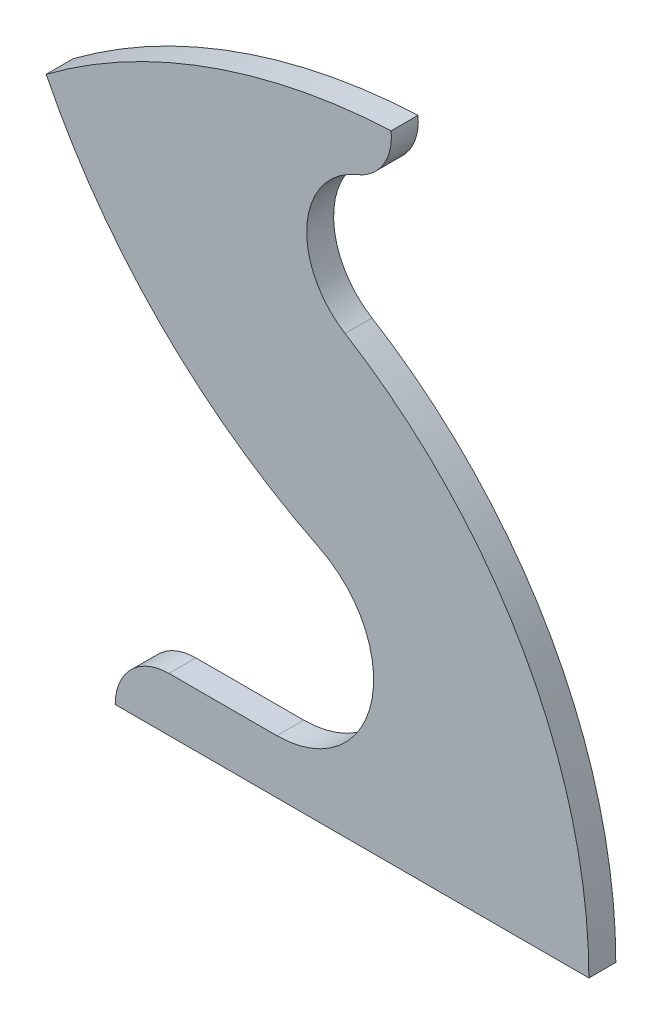
ISO-10303-21;
HEADER;
FILE_DESCRIPTION(('STEP AP214'),'2;1');
FILE_NAME('part.step','',(''),(''),'','','');
FILE_SCHEMA(('AUTOMOTIVE_DESIGN { 1 0 10303 214 1 1 1 1 }'));
ENDSEC;
DATA;
#1=APPLICATION_CONTEXT('core data for automotive mechanical design processes');
#2=APPLICATION_PROTOCOL_DEFINITION('international standard','automotive_design',2000,#1);
#3=PRODUCT_CONTEXT('',#1,'mechanical');
#4=PRODUCT('Part','Part','',(#3));
#5=PRODUCT_RELATED_PRODUCT_CATEGORY('part','',(#4));
#6=PRODUCT_DEFINITION_FORMATION('','',#4);
#7=PRODUCT_DEFINITION_CONTEXT('part definition',#1,'design');
#8=PRODUCT_DEFINITION('design','',#6,#7);
#9=PRODUCT_DEFINITION_SHAPE('','',#8);
#10=(LENGTH_UNIT() NAMED_UNIT(*) SI_UNIT(.MILLI.,.METRE.));
#11=(NAMED_UNIT(*) PLANE_ANGLE_UNIT() SI_UNIT($,.RADIAN.));
#12=(NAMED_UNIT(*) SI_UNIT($,.STERADIAN.) SOLID_ANGLE_UNIT());
#13=UNCERTAINTY_MEASURE_WITH_UNIT(LENGTH_MEASURE(1.E-05),#10,'distance_accuracy_value','');
#14=(GEOMETRIC_REPRESENTATION_CONTEXT(3) GLOBAL_UNCERTAINTY_ASSIGNED_CONTEXT((#13)) GLOBAL_UNIT_ASSIGNED_CONTEXT((#10,
#11,#12)) REPRESENTATION_CONTEXT('',''));
#15=CARTESIAN_POINT('',(0.,0.,0.));
#16=DIRECTION('',(0.,0.,1.));
#17=DIRECTION('',(1.,0.,0.));
#18=AXIS2_PLACEMENT_3D('',#15,#16,#17);
#19=CARTESIAN_POINT('',(11.2916982495796,89.0411675595262,5.));
#20=DIRECTION('',(0.,0.,-1.));
#21=DIRECTION('',(-1.,0.,0.));
#22=AXIS2_PLACEMENT_3D('',#19,#20,#21);
#23=CYLINDRICAL_SURFACE('',#22,9.999999999998);
#24=CARTESIAN_POINT('',(11.2916982495796,89.0411675595262,0.));
#25=DIRECTION('',(0.,0.,1.));
#26=DIRECTION('',(1.,0.,0.));
#27=AXIS2_PLACEMENT_3D('',#24,#25,#26);
#28=CIRCLE('',#27,9.999999999998);
#29=CARTESIAN_POINT('',(14.9970954723536,79.7530013561572,0.));
#30=VERTEX_POINT('',#29);
#31=CARTESIAN_POINT('',(21.2520717383504,89.930526859332,0.));
#32=VERTEX_POINT('',#31);
#33=EDGE_CURVE('E137',#30,#32,#28,.T.);
#34=ORIENTED_EDGE('',*,*,#33,.T.);
#35=DIRECTION('',(0.,0.,-1.));
#36=VECTOR('',#35,1.);
#37=CARTESIAN_POINT('',(21.2520717383504,89.930526859332,5.));
#38=LINE('',#37,#36);
#39=CARTESIAN_POINT('',(21.2520717383504,89.930526859332,5.));
#40=VERTEX_POINT('',#39);
#41=EDGE_CURVE('E11',#40,#32,#38,.T.);
#42=ORIENTED_EDGE('',*,*,#41,.F.);
#43=CARTESIAN_POINT('',(11.2916982495796,89.0411675595262,5.));
#44=DIRECTION('',(0.,0.,1.));
#45=DIRECTION('',(1.,0.,0.));
#46=AXIS2_PLACEMENT_3D('',#43,#44,#45);
#47=CIRCLE('',#46,9.999999999998);
#48=CARTESIAN_POINT('',(14.9970954723536,79.7530013561572,5.));
#49=VERTEX_POINT('',#48);
#50=EDGE_CURVE('E158',#49,#40,#47,.T.);
#51=ORIENTED_EDGE('',*,*,#50,.F.);
#52=DIRECTION('',(0.,0.,-1.));
#53=VECTOR('',#52,1.);
#54=CARTESIAN_POINT('',(14.9970954723536,79.7530013561572,5.));
#55=LINE('',#54,#53);
#56=EDGE_CURVE('E49',#49,#30,#55,.T.);
#57=ORIENTED_EDGE('',*,*,#56,.T.);
#58=EDGE_LOOP('',(#34,#42,#51,#57));
#59=FACE_BOUND('',#58,.T.);
#60=ADVANCED_FACE('F33',(#59),#23,.T.);
#61=CARTESIAN_POINT('',(26.5788648030549,-25.9471037500549,5.));
#62=DIRECTION('',(0.,0.,-1.));
#63=DIRECTION('',(-1.,0.,0.));
#64=AXIS2_PLACEMENT_3D('',#61,#62,#63);
#65=CYLINDRICAL_SURFACE('',#64,115.999999999999);
#66=CARTESIAN_POINT('',(26.5788648030549,-25.9471037500549,0.));
#67=DIRECTION('',(0.,0.,1.));
#68=DIRECTION('',(1.,0.,0.));
#69=AXIS2_PLACEMENT_3D('',#66,#67,#68);
#70=CIRCLE('',#69,115.999999999999);
#71=CARTESIAN_POINT('',(-42.8351254526563,66.9921127130709,0.));
#72=VERTEX_POINT('',#71);
#73=EDGE_CURVE('E139',#32,#72,#70,.T.);
#74=ORIENTED_EDGE('',*,*,#73,.T.);
#75=DIRECTION('',(0.,0.,-1.));
#76=VECTOR('',#75,1.);
#77=CARTESIAN_POINT('',(-42.8351254526563,66.9921127130709,5.));
#78=LINE('',#77,#76);
#79=CARTESIAN_POINT('',(-42.8351254526563,66.9921127130709,5.));
#80=VERTEX_POINT('',#79);
#81=EDGE_CURVE('E41',#80,#72,#78,.T.);
#82=ORIENTED_EDGE('',*,*,#81,.F.);
#83=CARTESIAN_POINT('',(26.5788648030549,-25.9471037500549,5.));
#84=DIRECTION('',(0.,0.,1.));
#85=DIRECTION('',(1.,0.,0.));
#86=AXIS2_PLACEMENT_3D('',#83,#84,#85);
#87=CIRCLE('',#86,115.999999999999);
#88=EDGE_CURVE('E91',#40,#80,#87,.T.);
#89=ORIENTED_EDGE('',*,*,#88,.F.);
#90=ORIENTED_EDGE('',*,*,#41,.T.);
#91=EDGE_LOOP('',(#74,#82,#89,#90));
#92=FACE_BOUND('',#91,.T.);
#93=ADVANCED_FACE('F192',(#92),#65,.T.);
#94=CARTESIAN_POINT('',(57.9835512224669,116.911295576453,5.));
#95=DIRECTION('',(0.,0.,-1.));
#96=DIRECTION('',(-1.,0.,0.));
#97=AXIS2_PLACEMENT_3D('',#94,#95,#96);
#98=CYLINDRICAL_SURFACE('',#97,112.500357262858);
#99=CARTESIAN_POINT('',(57.9835512224669,116.911295576453,0.));
#100=DIRECTION('',(0.,0.,1.));
#101=DIRECTION('',(1.,0.,0.));
#102=AXIS2_PLACEMENT_3D('',#99,#100,#101);
#103=CIRCLE('',#102,112.500357262858);
#104=CARTESIAN_POINT('',(7.99770930819777,16.1256517952451,0.));
#105=VERTEX_POINT('',#104);
#106=EDGE_CURVE('E141',#72,#105,#103,.T.);
#107=ORIENTED_EDGE('',*,*,#106,.T.);
#108=DIRECTION('',(0.,0.,-1.));
#109=VECTOR('',#108,1.);
#110=CARTESIAN_POINT('',(7.99770930819777,16.1256517952451,5.));
#111=LINE('',#110,#109);
#112=CARTESIAN_POINT('',(7.99770930819777,16.1256517952451,5.));
#113=VERTEX_POINT('',#112);
#114=EDGE_CURVE('E166',#113,#105,#111,.T.);
#115=ORIENTED_EDGE('',*,*,#114,.F.);
#116=CARTESIAN_POINT('',(57.9835512224669,116.911295576453,5.));
#117=DIRECTION('',(0.,0.,1.));
#118=DIRECTION('',(1.,0.,0.));
#119=AXIS2_PLACEMENT_3D('',#116,#117,#118);
#120=CIRCLE('',#119,112.500357262858);
#121=EDGE_CURVE('E173',#80,#113,#120,.T.);
#122=ORIENTED_EDGE('',*,*,#121,.F.);
#123=ORIENTED_EDGE('',*,*,#81,.T.);
#124=EDGE_LOOP('',(#107,#115,#122,#123));
#125=FACE_BOUND('',#124,.T.);
#126=ADVANCED_FACE('F171',(#125),#98,.T.);
#127=CARTESIAN_POINT('',(0.,0.,5.));
#128=DIRECTION('',(0.,0.,-1.));
#129=DIRECTION('',(-1.,0.,0.));
#130=AXIS2_PLACEMENT_3D('',#127,#128,#129);
#131=CYLINDRICAL_SURFACE('',#130,17.9999999999979);
#132=CARTESIAN_POINT('',(0.,0.,0.));
#133=DIRECTION('',(0.,0.,1.));
#134=DIRECTION('',(1.,0.,0.));
#135=AXIS2_PLACEMENT_3D('',#132,#133,#134);
#136=CIRCLE('',#135,17.9999999999979);
#137=CARTESIAN_POINT('',(0.,-17.9999999999979,0.));
#138=VERTEX_POINT('',#137);
#139=EDGE_CURVE('E144',#138,#105,#136,.T.);
#140=ORIENTED_EDGE('',*,*,#139,.F.);
#141=DIRECTION('',(0.,0.,-1.));
#142=VECTOR('',#141,1.);
#143=CARTESIAN_POINT('',(0.,-17.9999999999979,5.));
#144=LINE('',#143,#142);
#145=CARTESIAN_POINT('',(0.,-17.9999999999979,5.));
#146=VERTEX_POINT('',#145);
#147=EDGE_CURVE('E164',#146,#138,#144,.T.);
#148=ORIENTED_EDGE('',*,*,#147,.F.);
#149=CARTESIAN_POINT('',(0.,0.,5.));
#150=DIRECTION('',(0.,0.,1.));
#151=DIRECTION('',(1.,0.,0.));
#152=AXIS2_PLACEMENT_3D('',#149,#150,#151);
#153=CIRCLE('',#152,17.9999999999979);
#154=EDGE_CURVE('E183',#146,#113,#153,.T.);
#155=ORIENTED_EDGE('',*,*,#154,.T.);
#156=ORIENTED_EDGE('',*,*,#114,.T.);
#157=EDGE_LOOP('',(#140,#148,#155,#156));
#158=FACE_BOUND('',#157,.T.);
#159=ADVANCED_FACE('F180',(#158),#131,.F.);
#160=CARTESIAN_POINT('',(1.91564088810925E-12,-17.9999999999979,5.));
#161=DIRECTION('',(-1.0642449378386E-13,1.,0.));
#162=DIRECTION('',(-1.,-1.0642449378386E-13,0.));
#163=AXIS2_PLACEMENT_3D('',#160,#161,#162);
#164=PLANE('',#163);
#165=DIRECTION('',(1.,1.0642449378386E-13,0.));
#166=VECTOR('',#165,1.);
#167=CARTESIAN_POINT('',(1.91564088810925E-12,-17.9999999999979,0.));
#168=LINE('',#167,#166);
#169=CARTESIAN_POINT('',(-20.0164487775331,-18.,0.));
#170=VERTEX_POINT('',#169);
#171=EDGE_CURVE('E147',#170,#138,#168,.T.);
#172=ORIENTED_EDGE('',*,*,#171,.F.);
#173=DIRECTION('',(0.,0.,-1.));
#174=VECTOR('',#173,1.);
#175=CARTESIAN_POINT('',(-20.0164487775331,-18.,5.));
#176=LINE('',#175,#174);
#177=CARTESIAN_POINT('',(-20.0164487775331,-18.,5.));
#178=VERTEX_POINT('',#177);
#179=EDGE_CURVE('E162',#178,#170,#176,.T.);
#180=ORIENTED_EDGE('',*,*,#179,.F.);
#181=DIRECTION('',(1.,1.0642449378386E-13,0.));
#182=VECTOR('',#181,1.);
#183=CARTESIAN_POINT('',(1.91564088810925E-12,-17.9999999999979,5.));
#184=LINE('',#183,#182);
#185=EDGE_CURVE('E185',#178,#146,#184,.T.);
#186=ORIENTED_EDGE('',*,*,#185,.T.);
#187=ORIENTED_EDGE('',*,*,#147,.T.);
#188=EDGE_LOOP('',(#172,#180,#186,#187));
#189=FACE_BOUND('',#188,.T.);
#190=ADVANCED_FACE('F202',(#189),#164,.T.);
#191=CARTESIAN_POINT('',(-20.0164487775331,-28.,5.));
#192=DIRECTION('',(0.,0.,-1.));
#193=DIRECTION('',(-1.,0.,0.));
#194=AXIS2_PLACEMENT_3D('',#191,#192,#193);
#195=CYLINDRICAL_SURFACE('',#194,10.);
#196=CARTESIAN_POINT('',(-20.0164487775331,-28.,0.));
#197=DIRECTION('',(0.,0.,1.));
#198=DIRECTION('',(1.,0.,0.));
#199=AXIS2_PLACEMENT_3D('',#196,#197,#198);
#200=CIRCLE('',#199,10.);
#201=CARTESIAN_POINT('',(-30.0164487775331,-28.,0.));
#202=VERTEX_POINT('',#201);
#203=EDGE_CURVE('E150',#170,#202,#200,.T.);
#204=ORIENTED_EDGE('',*,*,#203,.T.);
#205=DIRECTION('',(0.,0.,-1.));
#206=VECTOR('',#205,1.);
#207=CARTESIAN_POINT('',(-30.0164487775331,-28.,5.));
#208=LINE('',#207,#206);
#209=CARTESIAN_POINT('',(-30.0164487775331,-28.,5.));
#210=VERTEX_POINT('',#209);
#211=EDGE_CURVE('E129',#210,#202,#208,.T.);
#212=ORIENTED_EDGE('',*,*,#211,.F.);
#213=CARTESIAN_POINT('',(-20.0164487775331,-28.,5.));
#214=DIRECTION('',(0.,0.,1.));
#215=DIRECTION('',(1.,0.,0.));
#216=AXIS2_PLACEMENT_3D('',#213,#214,#215);
#217=CIRCLE('',#216,10.);
#218=EDGE_CURVE('E117',#178,#210,#217,.T.);
#219=ORIENTED_EDGE('',*,*,#218,.F.);
#220=ORIENTED_EDGE('',*,*,#179,.T.);
#221=EDGE_LOOP('',(#204,#212,#219,#220));
#222=FACE_BOUND('',#221,.T.);
#223=ADVANCED_FACE('F205',(#222),#195,.T.);
#224=CARTESIAN_POINT('',(0.,-28.,5.));
#225=DIRECTION('',(0.,1.,0.));
#226=DIRECTION('',(-1.,0.,0.));
#227=AXIS2_PLACEMENT_3D('',#224,#225,#226);
#228=PLANE('',#227);
#229=DIRECTION('',(1.,0.,0.));
#230=VECTOR('',#229,1.);
#231=CARTESIAN_POINT('',(0.,-28.,0.));
#232=LINE('',#231,#230);
#233=CARTESIAN_POINT('',(57.9835512224669,-28.,0.));
#234=VERTEX_POINT('',#233);
#235=EDGE_CURVE('E126',#202,#234,#232,.T.);
#236=ORIENTED_EDGE('',*,*,#235,.T.);
#237=DIRECTION('',(0.,0.,-1.));
#238=VECTOR('',#237,1.);
#239=CARTESIAN_POINT('',(57.9835512224669,-28.,5.));
#240=LINE('',#239,#238);
#241=CARTESIAN_POINT('',(57.9835512224669,-28.,5.));
#242=VERTEX_POINT('',#241);
#243=EDGE_CURVE('E123',#242,#234,#240,.T.);
#244=ORIENTED_EDGE('',*,*,#243,.F.);
#245=DIRECTION('',(1.,0.,0.));
#246=VECTOR('',#245,1.);
#247=CARTESIAN_POINT('',(0.,-28.,5.));
#248=LINE('',#247,#246);
#249=EDGE_CURVE('E109',#210,#242,#248,.T.);
#250=ORIENTED_EDGE('',*,*,#249,.F.);
#251=ORIENTED_EDGE('',*,*,#211,.T.);
#252=EDGE_LOOP('',(#236,#244,#250,#251));
#253=FACE_BOUND('',#252,.T.);
#254=ADVANCED_FACE('F124',(#253),#228,.F.);
#255=CARTESIAN_POINT('',(-37.1769273565635,-28.0000000000042,5.));
#256=DIRECTION('',(0.,0.,-1.));
#257=DIRECTION('',(-1.,0.,0.));
#258=AXIS2_PLACEMENT_3D('',#255,#256,#257);
#259=CYLINDRICAL_SURFACE('',#258,95.1604785790298);
#260=CARTESIAN_POINT('',(-37.1769273565635,-28.0000000000042,0.));
#261=DIRECTION('',(0.,0.,1.));
#262=DIRECTION('',(1.,0.,0.));
#263=AXIS2_PLACEMENT_3D('',#260,#261,#262);
#264=CIRCLE('',#263,95.1604785790298);
#265=CARTESIAN_POINT('',(12.6940981893016,53.0456506815324,0.));
#266=VERTEX_POINT('',#265);
#267=EDGE_CURVE('E153',#234,#266,#264,.T.);
#268=ORIENTED_EDGE('',*,*,#267,.T.);
#269=DIRECTION('',(0.,0.,-1.));
#270=VECTOR('',#269,1.);
#271=CARTESIAN_POINT('',(12.6940981893016,53.0456506815324,5.));
#272=LINE('',#271,#270);
#273=CARTESIAN_POINT('',(12.6940981893016,53.0456506815324,5.));
#274=VERTEX_POINT('',#273);
#275=EDGE_CURVE('E79',#274,#266,#272,.T.);
#276=ORIENTED_EDGE('',*,*,#275,.F.);
#277=CARTESIAN_POINT('',(-37.1769273565635,-28.0000000000042,5.));
#278=DIRECTION('',(0.,0.,1.));
#279=DIRECTION('',(1.,0.,0.));
#280=AXIS2_PLACEMENT_3D('',#277,#278,#279);
#281=CIRCLE('',#280,95.1604785790298);
#282=EDGE_CURVE('E114',#242,#274,#281,.T.);
#283=ORIENTED_EDGE('',*,*,#282,.F.);
#284=ORIENTED_EDGE('',*,*,#243,.T.);
#285=EDGE_LOOP('',(#268,#276,#283,#284));
#286=FACE_BOUND('',#285,.T.);
#287=ADVANCED_FACE('F131',(#286),#259,.T.);
#288=CARTESIAN_POINT('',(20.5551913065107,65.8207520510951,5.));
#289=DIRECTION('',(0.,0.,-1.));
#290=DIRECTION('',(-1.,0.,0.));
#291=AXIS2_PLACEMENT_3D('',#288,#289,#290);
#292=CYLINDRICAL_SURFACE('',#291,15.0000000000026);
#293=CARTESIAN_POINT('',(20.5551913065107,65.8207520510951,0.));
#294=DIRECTION('',(0.,0.,1.));
#295=DIRECTION('',(1.,0.,0.));
#296=AXIS2_PLACEMENT_3D('',#293,#294,#295);
#297=CIRCLE('',#296,15.0000000000026);
#298=EDGE_CURVE('E155',#30,#266,#297,.T.);
#299=ORIENTED_EDGE('',*,*,#298,.F.);
#300=ORIENTED_EDGE('',*,*,#56,.F.);
#301=CARTESIAN_POINT('',(20.5551913065107,65.8207520510951,5.));
#302=DIRECTION('',(0.,0.,1.));
#303=DIRECTION('',(1.,0.,0.));
#304=AXIS2_PLACEMENT_3D('',#301,#302,#303);
#305=CIRCLE('',#304,15.0000000000026);
#306=EDGE_CURVE('E132',#49,#274,#305,.T.);
#307=ORIENTED_EDGE('',*,*,#306,.T.);
#308=ORIENTED_EDGE('',*,*,#275,.T.);
#309=EDGE_LOOP('',(#299,#300,#307,#308));
#310=FACE_BOUND('',#309,.T.);
#311=ADVANCED_FACE('F214',(#310),#292,.F.);
#312=CARTESIAN_POINT('',(0.,0.,5.));
#313=DIRECTION('',(0.,0.,1.));
#314=DIRECTION('',(1.,0.,0.));
#315=AXIS2_PLACEMENT_3D('',#312,#313,#314);
#316=PLANE('',#315);
#317=ORIENTED_EDGE('',*,*,#50,.T.);
#318=ORIENTED_EDGE('',*,*,#88,.T.);
#319=ORIENTED_EDGE('',*,*,#121,.T.);
#320=ORIENTED_EDGE('',*,*,#154,.F.);
#321=ORIENTED_EDGE('',*,*,#185,.F.);
#322=ORIENTED_EDGE('',*,*,#218,.T.);
#323=ORIENTED_EDGE('',*,*,#249,.T.);
#324=ORIENTED_EDGE('',*,*,#282,.T.);
#325=ORIENTED_EDGE('',*,*,#306,.F.);
#326=EDGE_LOOP('',(#317,#318,#319,#320,#321,#322,#323,#324,#325));
#327=FACE_BOUND('',#326,.T.);
#328=ADVANCED_FACE('F111',(#327),#316,.T.);
#329=CARTESIAN_POINT('',(0.,0.,0.));
#330=DIRECTION('',(0.,0.,1.));
#331=DIRECTION('',(1.,0.,0.));
#332=AXIS2_PLACEMENT_3D('',#329,#330,#331);
#333=PLANE('',#332);
#334=ORIENTED_EDGE('',*,*,#33,.F.);
#335=ORIENTED_EDGE('',*,*,#298,.T.);
#336=ORIENTED_EDGE('',*,*,#267,.F.);
#337=ORIENTED_EDGE('',*,*,#235,.F.);
#338=ORIENTED_EDGE('',*,*,#203,.F.);
#339=ORIENTED_EDGE('',*,*,#171,.T.);
#340=ORIENTED_EDGE('',*,*,#139,.T.);
#341=ORIENTED_EDGE('',*,*,#106,.F.);
#342=ORIENTED_EDGE('',*,*,#73,.F.);
#343=EDGE_LOOP('',(#334,#335,#336,#337,#338,#339,#340,#341,#342));
#344=FACE_BOUND('',#343,.T.);
#345=ADVANCED_FACE('F175',(#344),#333,.F.);
#346=CLOSED_SHELL('',(#60,#93,#126,#159,#190,#223,#254,#287,#311,#328,#345));
#347=MANIFOLD_SOLID_BREP('B2',#346);
#348=ADVANCED_BREP_SHAPE_REPRESENTATION('',(#18,#347),#14);
#349=SHAPE_DEFINITION_REPRESENTATION(#9,#348);
ENDSEC;
END-ISO-10303-21;
